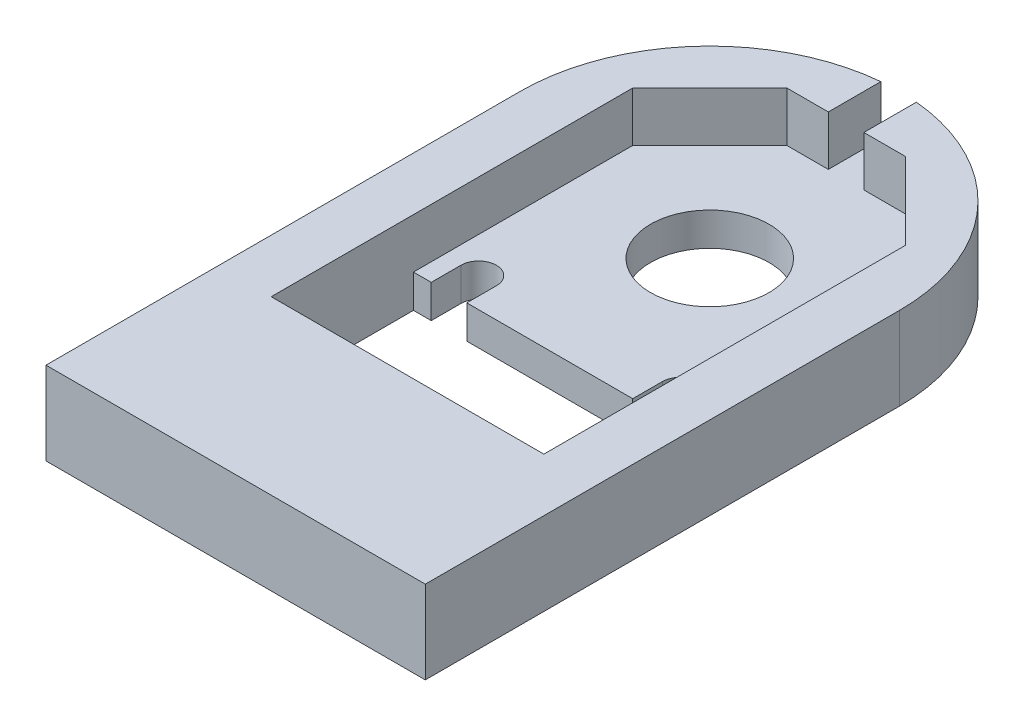
ISO-10303-21;
HEADER;
FILE_DESCRIPTION(('STEP AP214'),'2;1');
FILE_NAME('part.step','',(''),(''),'','','');
FILE_SCHEMA(('AUTOMOTIVE_DESIGN { 1 0 10303 214 1 1 1 1 }'));
ENDSEC;
DATA;
#1=APPLICATION_CONTEXT('core data for automotive mechanical design processes');
#2=APPLICATION_PROTOCOL_DEFINITION('international standard','automotive_design',2000,#1);
#3=PRODUCT_CONTEXT('',#1,'mechanical');
#4=PRODUCT('Part','Part','',(#3));
#5=PRODUCT_RELATED_PRODUCT_CATEGORY('part','',(#4));
#6=PRODUCT_DEFINITION_FORMATION('','',#4);
#7=PRODUCT_DEFINITION_CONTEXT('part definition',#1,'design');
#8=PRODUCT_DEFINITION('design','',#6,#7);
#9=PRODUCT_DEFINITION_SHAPE('','',#8);
#10=(LENGTH_UNIT() NAMED_UNIT(*) SI_UNIT(.MILLI.,.METRE.));
#11=(NAMED_UNIT(*) PLANE_ANGLE_UNIT() SI_UNIT($,.RADIAN.));
#12=(NAMED_UNIT(*) SI_UNIT($,.STERADIAN.) SOLID_ANGLE_UNIT());
#13=UNCERTAINTY_MEASURE_WITH_UNIT(LENGTH_MEASURE(1.E-05),#10,'distance_accuracy_value','');
#14=(GEOMETRIC_REPRESENTATION_CONTEXT(3) GLOBAL_UNCERTAINTY_ASSIGNED_CONTEXT((#13)) GLOBAL_UNIT_ASSIGNED_CONTEXT((#10,
#11,#12)) REPRESENTATION_CONTEXT('',''));
#15=CARTESIAN_POINT('',(0.,0.,0.));
#16=DIRECTION('',(0.,0.,1.));
#17=DIRECTION('',(1.,0.,0.));
#18=AXIS2_PLACEMENT_3D('',#15,#16,#17);
#19=CARTESIAN_POINT('',(8.,2.1,0.));
#20=DIRECTION('',(-1.,0.,0.));
#21=DIRECTION('',(0.,0.,1.));
#22=AXIS2_PLACEMENT_3D('',#19,#20,#21);
#23=PLANE('',#22);
#24=DIRECTION('',(0.,-1.,0.));
#25=VECTOR('',#24,1.);
#26=CARTESIAN_POINT('',(8.,2.1,20.));
#27=LINE('',#26,#25);
#28=CARTESIAN_POINT('',(8.,2.1,20.));
#29=VERTEX_POINT('',#28);
#30=CARTESIAN_POINT('',(8.,-1.4,20.));
#31=VERTEX_POINT('',#30);
#32=EDGE_CURVE('E345',#29,#31,#27,.T.);
#33=ORIENTED_EDGE('',*,*,#32,.T.);
#34=DIRECTION('',(0.,0.,-1.));
#35=VECTOR('',#34,1.);
#36=CARTESIAN_POINT('',(8.,-1.4,0.));
#37=LINE('',#36,#35);
#38=CARTESIAN_POINT('',(8.,-1.4,0.));
#39=VERTEX_POINT('',#38);
#40=EDGE_CURVE('E309',#31,#39,#37,.T.);
#41=ORIENTED_EDGE('',*,*,#40,.T.);
#42=DIRECTION('',(0.,-1.,0.));
#43=VECTOR('',#42,1.);
#44=CARTESIAN_POINT('',(8.,2.1,0.));
#45=LINE('',#44,#43);
#46=CARTESIAN_POINT('',(8.,2.1,0.));
#47=VERTEX_POINT('',#46);
#48=EDGE_CURVE('E392',#47,#39,#45,.T.);
#49=ORIENTED_EDGE('',*,*,#48,.F.);
#50=DIRECTION('',(0.,0.,-1.));
#51=VECTOR('',#50,1.);
#52=CARTESIAN_POINT('',(8.,2.1,0.));
#53=LINE('',#52,#51);
#54=EDGE_CURVE('E315',#29,#47,#53,.T.);
#55=ORIENTED_EDGE('',*,*,#54,.F.);
#56=EDGE_LOOP('',(#33,#41,#49,#55));
#57=FACE_BOUND('',#56,.T.);
#58=ADVANCED_FACE('F36',(#57),#23,.F.);
#59=CARTESIAN_POINT('',(0.75,2.1,0.));
#60=DIRECTION('',(-1.,0.,0.));
#61=DIRECTION('',(0.,0.,1.));
#62=AXIS2_PLACEMENT_3D('',#59,#60,#61);
#63=PLANE('',#62);
#64=DIRECTION('',(0.,0.,-1.));
#65=VECTOR('',#64,1.);
#66=CARTESIAN_POINT('',(0.75,0.,0.));
#67=LINE('',#66,#65);
#68=CARTESIAN_POINT('',(0.75,0.,-5.75));
#69=VERTEX_POINT('',#68);
#70=CARTESIAN_POINT('',(0.75,0.,-7.964766161037));
#71=VERTEX_POINT('',#70);
#72=EDGE_CURVE('E312',#69,#71,#67,.T.);
#73=ORIENTED_EDGE('',*,*,#72,.F.);
#74=DIRECTION('',(0.,-1.,0.));
#75=VECTOR('',#74,1.);
#76=CARTESIAN_POINT('',(0.75,2.1,-5.75));
#77=LINE('',#76,#75);
#78=CARTESIAN_POINT('',(0.75,2.1,-5.75));
#79=VERTEX_POINT('',#78);
#80=EDGE_CURVE('E388',#79,#69,#77,.T.);
#81=ORIENTED_EDGE('',*,*,#80,.F.);
#82=DIRECTION('',(0.,0.,-1.));
#83=VECTOR('',#82,1.);
#84=CARTESIAN_POINT('',(0.75,2.1,0.));
#85=LINE('',#84,#83);
#86=CARTESIAN_POINT('',(0.75,2.1,-7.964766161037));
#87=VERTEX_POINT('',#86);
#88=EDGE_CURVE('E321',#79,#87,#85,.T.);
#89=ORIENTED_EDGE('',*,*,#88,.T.);
#90=DIRECTION('',(0.,-1.,0.));
#91=VECTOR('',#90,1.);
#92=CARTESIAN_POINT('',(0.75,2.1,-7.964766161037));
#93=LINE('',#92,#91);
#94=EDGE_CURVE('E390',#87,#71,#93,.T.);
#95=ORIENTED_EDGE('',*,*,#94,.T.);
#96=EDGE_LOOP('',(#73,#81,#89,#95));
#97=FACE_BOUND('',#96,.T.);
#98=ADVANCED_FACE('F435',(#97),#63,.T.);
#99=CARTESIAN_POINT('',(0.,2.1,-5.75));
#100=DIRECTION('',(0.,0.,-1.));
#101=DIRECTION('',(-1.,0.,0.));
#102=AXIS2_PLACEMENT_3D('',#99,#100,#101);
#103=PLANE('',#102);
#104=DIRECTION('',(1.,0.,0.));
#105=VECTOR('',#104,1.);
#106=CARTESIAN_POINT('',(0.,0.,-5.75));
#107=LINE('',#106,#105);
#108=CARTESIAN_POINT('',(2.5,0.,-5.75));
#109=VERTEX_POINT('',#108);
#110=EDGE_CURVE('E348',#69,#109,#107,.T.);
#111=ORIENTED_EDGE('',*,*,#110,.T.);
#112=DIRECTION('',(0.,-1.,0.));
#113=VECTOR('',#112,1.);
#114=CARTESIAN_POINT('',(2.5,2.1,-5.75));
#115=LINE('',#114,#113);
#116=CARTESIAN_POINT('',(2.5,2.1,-5.75));
#117=VERTEX_POINT('',#116);
#118=EDGE_CURVE('E385',#117,#109,#115,.T.);
#119=ORIENTED_EDGE('',*,*,#118,.F.);
#120=DIRECTION('',(1.,0.,0.));
#121=VECTOR('',#120,1.);
#122=CARTESIAN_POINT('',(0.,2.1,-5.75));
#123=LINE('',#122,#121);
#124=EDGE_CURVE('E325',#79,#117,#123,.T.);
#125=ORIENTED_EDGE('',*,*,#124,.F.);
#126=ORIENTED_EDGE('',*,*,#80,.T.);
#127=EDGE_LOOP('',(#111,#119,#125,#126));
#128=FACE_BOUND('',#127,.T.);
#129=ADVANCED_FACE('F442',(#128),#103,.F.);
#130=CARTESIAN_POINT('',(4.12499999999926,2.1,-4.12500000000171));
#131=DIRECTION('',(0.707106781186337,0.,-0.707106781186758));
#132=DIRECTION('',(-0.707106781186758,0.,-0.707106781186337));
#133=AXIS2_PLACEMENT_3D('',#130,#131,#132);
#134=PLANE('',#133);
#135=DIRECTION('',(0.707106781186758,0.,0.707106781186337));
#136=VECTOR('',#135,1.);
#137=CARTESIAN_POINT('',(4.12499999999926,0.,-4.12500000000171));
#138=LINE('',#137,#136);
#139=CARTESIAN_POINT('',(5.75000000000307,0.,-2.49999999999886));
#140=VERTEX_POINT('',#139);
#141=EDGE_CURVE('E350',#109,#140,#138,.T.);
#142=ORIENTED_EDGE('',*,*,#141,.T.);
#143=DIRECTION('',(0.,-1.,0.));
#144=VECTOR('',#143,1.);
#145=CARTESIAN_POINT('',(5.75000000000307,2.1,-2.49999999999886));
#146=LINE('',#145,#144);
#147=CARTESIAN_POINT('',(5.75000000000307,2.1,-2.49999999999886));
#148=VERTEX_POINT('',#147);
#149=EDGE_CURVE('E383',#148,#140,#146,.T.);
#150=ORIENTED_EDGE('',*,*,#149,.F.);
#151=DIRECTION('',(0.707106781186758,0.,0.707106781186337));
#152=VECTOR('',#151,1.);
#153=CARTESIAN_POINT('',(4.12499999999926,2.1,-4.12500000000171));
#154=LINE('',#153,#152);
#155=EDGE_CURVE('E327',#117,#148,#154,.T.);
#156=ORIENTED_EDGE('',*,*,#155,.F.);
#157=ORIENTED_EDGE('',*,*,#118,.T.);
#158=EDGE_LOOP('',(#142,#150,#156,#157));
#159=FACE_BOUND('',#158,.T.);
#160=ADVANCED_FACE('F445',(#159),#134,.F.);
#161=CARTESIAN_POINT('',(5.75000000000307,2.1,0.));
#162=DIRECTION('',(-1.,0.,0.));
#163=DIRECTION('',(0.,0.,1.));
#164=AXIS2_PLACEMENT_3D('',#161,#162,#163);
#165=PLANE('',#164);
#166=DIRECTION('',(0.,0.,-1.));
#167=VECTOR('',#166,1.);
#168=CARTESIAN_POINT('',(5.75000000000307,0.,0.));
#169=LINE('',#168,#167);
#170=CARTESIAN_POINT('',(5.75000000000307,0.,6.75000000000546));
#171=VERTEX_POINT('',#170);
#172=EDGE_CURVE('E207',#171,#140,#169,.T.);
#173=ORIENTED_EDGE('',*,*,#172,.F.);
#174=DIRECTION('',(0.,1.,0.));
#175=VECTOR('',#174,1.);
#176=CARTESIAN_POINT('',(5.75000000000307,-1.4,6.75000000000546));
#177=LINE('',#176,#175);
#178=CARTESIAN_POINT('',(5.75000000000307,-1.4,6.75000000000546));
#179=VERTEX_POINT('',#178);
#180=EDGE_CURVE('E201',#179,#171,#177,.T.);
#181=ORIENTED_EDGE('',*,*,#180,.F.);
#182=DIRECTION('',(0.,0.,-1.));
#183=VECTOR('',#182,1.);
#184=CARTESIAN_POINT('',(5.75000000000307,-1.4,6.75000000000546));
#185=LINE('',#184,#183);
#186=CARTESIAN_POINT('',(5.75000000000307,-1.4,16.7500000000055));
#187=VERTEX_POINT('',#186);
#188=EDGE_CURVE('E205',#187,#179,#185,.T.);
#189=ORIENTED_EDGE('',*,*,#188,.F.);
#190=DIRECTION('',(0.,-0.529998940003178,0.847998304005089));
#191=VECTOR('',#190,1.);
#192=CARTESIAN_POINT('',(5.75000000000307,-1.4,16.7500000000055));
#193=LINE('',#192,#191);
#194=CARTESIAN_POINT('',(5.75000000000307,1.1,12.7500000000055));
#195=VERTEX_POINT('',#194);
#196=EDGE_CURVE('E45',#187,#195,#193,.F.);
#197=ORIENTED_EDGE('',*,*,#196,.T.);
#198=DIRECTION('',(0.,1.,0.));
#199=VECTOR('',#198,1.);
#200=CARTESIAN_POINT('',(5.75000000000307,-1.4,12.7500000000055));
#201=LINE('',#200,#199);
#202=CARTESIAN_POINT('',(5.75000000000307,2.1,12.7500000000055));
#203=VERTEX_POINT('',#202);
#204=EDGE_CURVE('E211',#195,#203,#201,.T.);
#205=ORIENTED_EDGE('',*,*,#204,.T.);
#206=DIRECTION('',(0.,0.,-1.));
#207=VECTOR('',#206,1.);
#208=CARTESIAN_POINT('',(5.75000000000307,2.1,0.));
#209=LINE('',#208,#207);
#210=EDGE_CURVE('E329',#203,#148,#209,.T.);
#211=ORIENTED_EDGE('',*,*,#210,.T.);
#212=ORIENTED_EDGE('',*,*,#149,.T.);
#213=EDGE_LOOP('',(#173,#181,#189,#197,#205,#211,#212));
#214=FACE_BOUND('',#213,.T.);
#215=ADVANCED_FACE('F203',(#214),#165,.T.);
#216=CARTESIAN_POINT('',(-5.75000000000083,2.1,-1.90812549694622E-12));
#217=DIRECTION('',(1.,0.,3.31847912512338E-13));
#218=DIRECTION('',(3.31847912512338E-13,0.,-1.));
#219=AXIS2_PLACEMENT_3D('',#216,#217,#218);
#220=PLANE('',#219);
#221=DIRECTION('',(-3.31847912512338E-13,0.,1.));
#222=VECTOR('',#221,1.);
#223=CARTESIAN_POINT('',(-5.75000000000083,0.,-1.90812549694622E-12));
#224=LINE('',#223,#222);
#225=CARTESIAN_POINT('',(-5.75,0.,-2.50000000000006));
#226=VERTEX_POINT('',#225);
#227=CARTESIAN_POINT('',(-5.75000000000307,0.,6.75000000000546));
#228=VERTEX_POINT('',#227);
#229=EDGE_CURVE('E358',#226,#228,#224,.T.);
#230=ORIENTED_EDGE('',*,*,#229,.F.);
#231=DIRECTION('',(0.,-1.,0.));
#232=VECTOR('',#231,1.);
#233=CARTESIAN_POINT('',(-5.75,2.1,-2.50000000000006));
#234=LINE('',#233,#232);
#235=CARTESIAN_POINT('',(-5.75,2.1,-2.50000000000006));
#236=VERTEX_POINT('',#235);
#237=EDGE_CURVE('E381',#236,#226,#234,.T.);
#238=ORIENTED_EDGE('',*,*,#237,.F.);
#239=DIRECTION('',(-3.31847912512338E-13,0.,1.));
#240=VECTOR('',#239,1.);
#241=CARTESIAN_POINT('',(-5.75000000000083,2.1,-1.90812549694622E-12));
#242=LINE('',#241,#240);
#243=CARTESIAN_POINT('',(-5.75000000000307,2.1,12.7500000000055));
#244=VERTEX_POINT('',#243);
#245=EDGE_CURVE('E332',#236,#244,#242,.T.);
#246=ORIENTED_EDGE('',*,*,#245,.T.);
#247=DIRECTION('',(0.,1.,0.));
#248=VECTOR('',#247,1.);
#249=CARTESIAN_POINT('',(-5.75000000000307,-1.4,12.7500000000055));
#250=LINE('',#249,#248);
#251=CARTESIAN_POINT('',(-5.75000000000307,1.1,12.7500000000055));
#252=VERTEX_POINT('',#251);
#253=EDGE_CURVE('E221',#252,#244,#250,.T.);
#254=ORIENTED_EDGE('',*,*,#253,.F.);
#255=DIRECTION('',(2.81406466998092E-13,0.529998940003178,-0.847998304005089));
#256=VECTOR('',#255,1.);
#257=CARTESIAN_POINT('',(-5.75000000000639,-1.39999999999914,16.7500000000041));
#258=LINE('',#257,#256);
#259=CARTESIAN_POINT('',(-5.75000000000307,-1.4,16.7500000000055));
#260=VERTEX_POINT('',#259);
#261=EDGE_CURVE('E11',#252,#260,#258,.F.);
#262=ORIENTED_EDGE('',*,*,#261,.T.);
#263=DIRECTION('',(0.,0.,1.));
#264=VECTOR('',#263,1.);
#265=CARTESIAN_POINT('',(-5.75000000000307,-1.4,12.7500000000055));
#266=LINE('',#265,#264);
#267=CARTESIAN_POINT('',(-5.75000000000307,-1.4,6.75000000000546));
#268=VERTEX_POINT('',#267);
#269=EDGE_CURVE('E230',#268,#260,#266,.T.);
#270=ORIENTED_EDGE('',*,*,#269,.F.);
#271=DIRECTION('',(0.,1.,0.));
#272=VECTOR('',#271,1.);
#273=CARTESIAN_POINT('',(-5.75000000000307,-1.4,6.75000000000546));
#274=LINE('',#273,#272);
#275=EDGE_CURVE('E210',#268,#228,#274,.T.);
#276=ORIENTED_EDGE('',*,*,#275,.T.);
#277=EDGE_LOOP('',(#230,#238,#246,#254,#262,#270,#276));
#278=FACE_BOUND('',#277,.T.);
#279=ADVANCED_FACE('F451',(#278),#220,.T.);
#280=CARTESIAN_POINT('',(-4.12499999999998,2.1,-4.12500000000005));
#281=DIRECTION('',(-0.707106781186541,0.,-0.707106781186554));
#282=DIRECTION('',(-0.707106781186554,0.,0.707106781186541));
#283=AXIS2_PLACEMENT_3D('',#280,#281,#282);
#284=PLANE('',#283);
#285=DIRECTION('',(0.707106781186554,0.,-0.707106781186541));
#286=VECTOR('',#285,1.);
#287=CARTESIAN_POINT('',(-4.12499999999998,0.,-4.12500000000005));
#288=LINE('',#287,#286);
#289=CARTESIAN_POINT('',(-2.5,0.,-5.75));
#290=VERTEX_POINT('',#289);
#291=EDGE_CURVE('E362',#226,#290,#288,.T.);
#292=ORIENTED_EDGE('',*,*,#291,.T.);
#293=DIRECTION('',(0.,-1.,0.));
#294=VECTOR('',#293,1.);
#295=CARTESIAN_POINT('',(-2.5,2.1,-5.75));
#296=LINE('',#295,#294);
#297=CARTESIAN_POINT('',(-2.5,2.1,-5.75));
#298=VERTEX_POINT('',#297);
#299=EDGE_CURVE('E378',#298,#290,#296,.T.);
#300=ORIENTED_EDGE('',*,*,#299,.F.);
#301=DIRECTION('',(0.707106781186554,0.,-0.707106781186541));
#302=VECTOR('',#301,1.);
#303=CARTESIAN_POINT('',(-4.12499999999998,2.1,-4.12500000000005));
#304=LINE('',#303,#302);
#305=EDGE_CURVE('E335',#236,#298,#304,.T.);
#306=ORIENTED_EDGE('',*,*,#305,.F.);
#307=ORIENTED_EDGE('',*,*,#237,.T.);
#308=EDGE_LOOP('',(#292,#300,#306,#307));
#309=FACE_BOUND('',#308,.T.);
#310=ADVANCED_FACE('F455',(#309),#284,.F.);
#311=CARTESIAN_POINT('',(0.,2.1,-5.75));
#312=DIRECTION('',(0.,0.,-1.));
#313=DIRECTION('',(-1.,0.,0.));
#314=AXIS2_PLACEMENT_3D('',#311,#312,#313);
#315=PLANE('',#314);
#316=DIRECTION('',(1.,0.,0.));
#317=VECTOR('',#316,1.);
#318=CARTESIAN_POINT('',(0.,0.,-5.75));
#319=LINE('',#318,#317);
#320=CARTESIAN_POINT('',(-0.75,0.,-5.75));
#321=VERTEX_POINT('',#320);
#322=EDGE_CURVE('E364',#290,#321,#319,.T.);
#323=ORIENTED_EDGE('',*,*,#322,.T.);
#324=DIRECTION('',(0.,-1.,0.));
#325=VECTOR('',#324,1.);
#326=CARTESIAN_POINT('',(-0.75,2.1,-5.75));
#327=LINE('',#326,#325);
#328=CARTESIAN_POINT('',(-0.75,2.1,-5.75));
#329=VERTEX_POINT('',#328);
#330=EDGE_CURVE('E375',#329,#321,#327,.T.);
#331=ORIENTED_EDGE('',*,*,#330,.F.);
#332=DIRECTION('',(1.,0.,0.));
#333=VECTOR('',#332,1.);
#334=CARTESIAN_POINT('',(0.,2.1,-5.75));
#335=LINE('',#334,#333);
#336=EDGE_CURVE('E337',#298,#329,#335,.T.);
#337=ORIENTED_EDGE('',*,*,#336,.F.);
#338=ORIENTED_EDGE('',*,*,#299,.T.);
#339=EDGE_LOOP('',(#323,#331,#337,#338));
#340=FACE_BOUND('',#339,.T.);
#341=ADVANCED_FACE('F457',(#340),#315,.F.);
#342=CARTESIAN_POINT('',(-0.75,2.1,0.));
#343=DIRECTION('',(-1.,0.,0.));
#344=DIRECTION('',(0.,0.,1.));
#345=AXIS2_PLACEMENT_3D('',#342,#343,#344);
#346=PLANE('',#345);
#347=DIRECTION('',(0.,0.,-1.));
#348=VECTOR('',#347,1.);
#349=CARTESIAN_POINT('',(-0.75,0.,0.));
#350=LINE('',#349,#348);
#351=CARTESIAN_POINT('',(-0.75,0.,-7.964766161037));
#352=VERTEX_POINT('',#351);
#353=EDGE_CURVE('E319',#321,#352,#350,.T.);
#354=ORIENTED_EDGE('',*,*,#353,.T.);
#355=DIRECTION('',(0.,-1.,0.));
#356=VECTOR('',#355,1.);
#357=CARTESIAN_POINT('',(-0.75,2.1,-7.964766161037));
#358=LINE('',#357,#356);
#359=CARTESIAN_POINT('',(-0.75,2.1,-7.964766161037));
#360=VERTEX_POINT('',#359);
#361=EDGE_CURVE('E372',#360,#352,#358,.T.);
#362=ORIENTED_EDGE('',*,*,#361,.F.);
#363=DIRECTION('',(0.,0.,-1.));
#364=VECTOR('',#363,1.);
#365=CARTESIAN_POINT('',(-0.75,2.1,0.));
#366=LINE('',#365,#364);
#367=EDGE_CURVE('E339',#329,#360,#366,.T.);
#368=ORIENTED_EDGE('',*,*,#367,.F.);
#369=ORIENTED_EDGE('',*,*,#330,.T.);
#370=EDGE_LOOP('',(#354,#362,#368,#369));
#371=FACE_BOUND('',#370,.T.);
#372=ADVANCED_FACE('F425',(#371),#346,.F.);
#373=CARTESIAN_POINT('',(0.,2.1,0.));
#374=DIRECTION('',(0.,-1.,0.));
#375=DIRECTION('',(0.,0.,-1.));
#376=AXIS2_PLACEMENT_3D('',#373,#374,#375);
#377=CYLINDRICAL_SURFACE('',#376,8.);
#378=ORIENTED_EDGE('',*,*,#361,.T.);
#379=CARTESIAN_POINT('',(0.,0.,0.));
#380=DIRECTION('',(0.,1.,0.));
#381=DIRECTION('',(0.,0.,1.));
#382=AXIS2_PLACEMENT_3D('',#379,#380,#381);
#383=CIRCLE('',#382,8.);
#384=EDGE_CURVE('E297',#71,#352,#383,.T.);
#385=ORIENTED_EDGE('',*,*,#384,.F.);
#386=ORIENTED_EDGE('',*,*,#94,.F.);
#387=CARTESIAN_POINT('',(0.,2.1,0.));
#388=DIRECTION('',(0.,1.,0.));
#389=DIRECTION('',(0.,0.,1.));
#390=AXIS2_PLACEMENT_3D('',#387,#388,#389);
#391=CIRCLE('',#390,8.);
#392=EDGE_CURVE('E318',#47,#87,#391,.T.);
#393=ORIENTED_EDGE('',*,*,#392,.F.);
#394=ORIENTED_EDGE('',*,*,#48,.T.);
#395=CARTESIAN_POINT('',(0.,-1.4,0.));
#396=DIRECTION('',(0.,1.,0.));
#397=DIRECTION('',(0.,0.,1.));
#398=AXIS2_PLACEMENT_3D('',#395,#396,#397);
#399=CIRCLE('',#398,8.);
#400=CARTESIAN_POINT('',(-8.,-1.4,0.));
#401=VERTEX_POINT('',#400);
#402=EDGE_CURVE('E300',#39,#401,#399,.T.);
#403=ORIENTED_EDGE('',*,*,#402,.T.);
#404=DIRECTION('',(0.,-1.,0.));
#405=VECTOR('',#404,1.);
#406=CARTESIAN_POINT('',(-8.,2.1,0.));
#407=LINE('',#406,#405);
#408=CARTESIAN_POINT('',(-8.,2.1,0.));
#409=VERTEX_POINT('',#408);
#410=EDGE_CURVE('E370',#409,#401,#407,.T.);
#411=ORIENTED_EDGE('',*,*,#410,.F.);
#412=EDGE_CURVE('E322',#360,#409,#391,.T.);
#413=ORIENTED_EDGE('',*,*,#412,.F.);
#414=EDGE_LOOP('',(#378,#385,#386,#393,#394,#403,#411,#413));
#415=FACE_BOUND('',#414,.T.);
#416=ADVANCED_FACE('F398',(#415),#377,.T.);
#417=CARTESIAN_POINT('',(-8.,2.1,0.));
#418=DIRECTION('',(1.,0.,0.));
#419=DIRECTION('',(0.,0.,-1.));
#420=AXIS2_PLACEMENT_3D('',#417,#418,#419);
#421=PLANE('',#420);
#422=ORIENTED_EDGE('',*,*,#410,.T.);
#423=DIRECTION('',(0.,0.,1.));
#424=VECTOR('',#423,1.);
#425=CARTESIAN_POINT('',(-8.,-1.4,20.));
#426=LINE('',#425,#424);
#427=CARTESIAN_POINT('',(-8.,-1.4,20.));
#428=VERTEX_POINT('',#427);
#429=EDGE_CURVE('E303',#401,#428,#426,.T.);
#430=ORIENTED_EDGE('',*,*,#429,.T.);
#431=DIRECTION('',(0.,-1.,0.));
#432=VECTOR('',#431,1.);
#433=CARTESIAN_POINT('',(-8.,2.1,20.));
#434=LINE('',#433,#432);
#435=CARTESIAN_POINT('',(-8.,2.1,20.));
#436=VERTEX_POINT('',#435);
#437=EDGE_CURVE('E368',#436,#428,#434,.T.);
#438=ORIENTED_EDGE('',*,*,#437,.F.);
#439=DIRECTION('',(0.,0.,1.));
#440=VECTOR('',#439,1.);
#441=CARTESIAN_POINT('',(-8.,2.1,0.));
#442=LINE('',#441,#440);
#443=EDGE_CURVE('E341',#409,#436,#442,.T.);
#444=ORIENTED_EDGE('',*,*,#443,.F.);
#445=EDGE_LOOP('',(#422,#430,#438,#444));
#446=FACE_BOUND('',#445,.T.);
#447=ADVANCED_FACE('F413',(#446),#421,.F.);
#448=CARTESIAN_POINT('',(0.,2.1,20.));
#449=DIRECTION('',(0.,0.,-1.));
#450=DIRECTION('',(-1.,0.,0.));
#451=AXIS2_PLACEMENT_3D('',#448,#449,#450);
#452=PLANE('',#451);
#453=ORIENTED_EDGE('',*,*,#437,.T.);
#454=DIRECTION('',(1.,0.,0.));
#455=VECTOR('',#454,1.);
#456=CARTESIAN_POINT('',(8.,-1.4,20.));
#457=LINE('',#456,#455);
#458=EDGE_CURVE('E306',#428,#31,#457,.T.);
#459=ORIENTED_EDGE('',*,*,#458,.T.);
#460=ORIENTED_EDGE('',*,*,#32,.F.);
#461=DIRECTION('',(1.,0.,0.));
#462=VECTOR('',#461,1.);
#463=CARTESIAN_POINT('',(0.,2.1,20.));
#464=LINE('',#463,#462);
#465=EDGE_CURVE('E343',#436,#29,#464,.T.);
#466=ORIENTED_EDGE('',*,*,#465,.F.);
#467=EDGE_LOOP('',(#453,#459,#460,#466));
#468=FACE_BOUND('',#467,.T.);
#469=ADVANCED_FACE('F410',(#468),#452,.F.);
#470=CARTESIAN_POINT('',(0.,2.1,0.));
#471=DIRECTION('',(0.,1.,0.));
#472=DIRECTION('',(0.,0.,1.));
#473=AXIS2_PLACEMENT_3D('',#470,#471,#472);
#474=PLANE('',#473);
#475=DIRECTION('',(1.,0.,0.));
#476=VECTOR('',#475,1.);
#477=CARTESIAN_POINT('',(5.75000000000307,2.1,12.7500000000055));
#478=LINE('',#477,#476);
#479=EDGE_CURVE('E233',#244,#203,#478,.T.);
#480=ORIENTED_EDGE('',*,*,#479,.F.);
#481=ORIENTED_EDGE('',*,*,#245,.F.);
#482=ORIENTED_EDGE('',*,*,#305,.T.);
#483=ORIENTED_EDGE('',*,*,#336,.T.);
#484=ORIENTED_EDGE('',*,*,#367,.T.);
#485=ORIENTED_EDGE('',*,*,#412,.T.);
#486=ORIENTED_EDGE('',*,*,#443,.T.);
#487=ORIENTED_EDGE('',*,*,#465,.T.);
#488=ORIENTED_EDGE('',*,*,#54,.T.);
#489=ORIENTED_EDGE('',*,*,#392,.T.);
#490=ORIENTED_EDGE('',*,*,#88,.F.);
#491=ORIENTED_EDGE('',*,*,#124,.T.);
#492=ORIENTED_EDGE('',*,*,#155,.T.);
#493=ORIENTED_EDGE('',*,*,#210,.F.);
#494=EDGE_LOOP('',(#480,#481,#482,#483,#484,#485,#486,#487,#488,#489,#490,#491,#492,#493));
#495=FACE_BOUND('',#494,.T.);
#496=ADVANCED_FACE('F420',(#495),#474,.T.);
#497=CARTESIAN_POINT('',(0.,0.,0.));
#498=DIRECTION('',(0.,1.,0.));
#499=DIRECTION('',(0.,0.,1.));
#500=AXIS2_PLACEMENT_3D('',#497,#498,#499);
#501=PLANE('',#500);
#502=CARTESIAN_POINT('',(0.,0.,0.));
#503=DIRECTION('',(0.,1.,0.));
#504=DIRECTION('',(0.,0.,1.));
#505=AXIS2_PLACEMENT_3D('',#502,#503,#504);
#506=CIRCLE('',#505,2.5);
#507=CARTESIAN_POINT('',(0.,0.,2.5));
#508=VERTEX_POINT('',#507);
#509=EDGE_CURVE('E286',#508,#508,#506,.T.);
#510=ORIENTED_EDGE('',*,*,#509,.F.);
#511=EDGE_LOOP('',(#510));
#512=FACE_BOUND('',#511,.T.);
#513=ORIENTED_EDGE('',*,*,#353,.F.);
#514=ORIENTED_EDGE('',*,*,#322,.F.);
#515=ORIENTED_EDGE('',*,*,#291,.F.);
#516=ORIENTED_EDGE('',*,*,#229,.T.);
#517=DIRECTION('',(1.,0.,0.));
#518=VECTOR('',#517,1.);
#519=CARTESIAN_POINT('',(0.,0.,6.75000000000546));
#520=LINE('',#519,#518);
#521=CARTESIAN_POINT('',(-5.,0.,6.75000000000546));
#522=VERTEX_POINT('',#521);
#523=EDGE_CURVE('E355',#228,#522,#520,.T.);
#524=ORIENTED_EDGE('',*,*,#523,.T.);
#525=DIRECTION('',(0.,0.,1.));
#526=VECTOR('',#525,1.);
#527=CARTESIAN_POINT('',(-5.,0.,5.50000000000546));
#528=LINE('',#527,#526);
#529=CARTESIAN_POINT('',(-5.,0.,5.50000000000546));
#530=VERTEX_POINT('',#529);
#531=EDGE_CURVE('E279',#530,#522,#528,.T.);
#532=ORIENTED_EDGE('',*,*,#531,.F.);
#533=CARTESIAN_POINT('',(-4.25,0.,5.50000000000546));
#534=DIRECTION('',(0.,1.,0.));
#535=DIRECTION('',(0.,0.,1.));
#536=AXIS2_PLACEMENT_3D('',#533,#534,#535);
#537=CIRCLE('',#536,0.75);
#538=CARTESIAN_POINT('',(-3.5,0.,5.50000000000546));
#539=VERTEX_POINT('',#538);
#540=EDGE_CURVE('E261',#539,#530,#537,.T.);
#541=ORIENTED_EDGE('',*,*,#540,.F.);
#542=DIRECTION('',(0.,0.,-1.));
#543=VECTOR('',#542,1.);
#544=CARTESIAN_POINT('',(-3.5,0.,6.75000000000546));
#545=LINE('',#544,#543);
#546=CARTESIAN_POINT('',(-3.5,0.,6.75000000000546));
#547=VERTEX_POINT('',#546);
#548=EDGE_CURVE('E271',#547,#539,#545,.T.);
#549=ORIENTED_EDGE('',*,*,#548,.F.);
#550=CARTESIAN_POINT('',(3.50000000000307,0.,6.75000000000546));
#551=VERTEX_POINT('',#550);
#552=EDGE_CURVE('E359',#547,#551,#520,.T.);
#553=ORIENTED_EDGE('',*,*,#552,.T.);
#554=DIRECTION('',(0.,0.,1.));
#555=VECTOR('',#554,1.);
#556=CARTESIAN_POINT('',(3.50000000000307,0.,5.50000000000546));
#557=LINE('',#556,#555);
#558=CARTESIAN_POINT('',(3.50000000000307,0.,5.50000000000546));
#559=VERTEX_POINT('',#558);
#560=EDGE_CURVE('E254',#559,#551,#557,.T.);
#561=ORIENTED_EDGE('',*,*,#560,.F.);
#562=CARTESIAN_POINT('',(4.25000000000307,0.,5.50000000000546));
#563=DIRECTION('',(0.,1.,0.));
#564=DIRECTION('',(0.,0.,1.));
#565=AXIS2_PLACEMENT_3D('',#562,#563,#564);
#566=CIRCLE('',#565,0.75);
#567=CARTESIAN_POINT('',(5.00000000000307,0.,5.50000000000546));
#568=VERTEX_POINT('',#567);
#569=EDGE_CURVE('E239',#568,#559,#566,.T.);
#570=ORIENTED_EDGE('',*,*,#569,.F.);
#571=DIRECTION('',(0.,0.,-1.));
#572=VECTOR('',#571,1.);
#573=CARTESIAN_POINT('',(5.00000000000307,0.,6.75000000000546));
#574=LINE('',#573,#572);
#575=CARTESIAN_POINT('',(5.00000000000307,0.,6.75000000000546));
#576=VERTEX_POINT('',#575);
#577=EDGE_CURVE('E247',#576,#568,#574,.T.);
#578=ORIENTED_EDGE('',*,*,#577,.F.);
#579=EDGE_CURVE('E354',#576,#171,#520,.T.);
#580=ORIENTED_EDGE('',*,*,#579,.T.);
#581=ORIENTED_EDGE('',*,*,#172,.T.);
#582=ORIENTED_EDGE('',*,*,#141,.F.);
#583=ORIENTED_EDGE('',*,*,#110,.F.);
#584=ORIENTED_EDGE('',*,*,#72,.T.);
#585=ORIENTED_EDGE('',*,*,#384,.T.);
#586=EDGE_LOOP('',(#513,#514,#515,#516,#524,#532,#541,#549,#553,#561,#570,#578,#580,#581,#582,
#583,#584,#585));
#587=FACE_BOUND('',#586,.T.);
#588=ADVANCED_FACE('F429',(#512,#587),#501,.T.);
#589=CARTESIAN_POINT('',(0.,-1.4,0.));
#590=DIRECTION('',(0.,1.,0.));
#591=DIRECTION('',(0.,0.,1.));
#592=AXIS2_PLACEMENT_3D('',#589,#590,#591);
#593=PLANE('',#592);
#594=DIRECTION('',(1.,0.,0.));
#595=VECTOR('',#594,1.);
#596=CARTESIAN_POINT('',(0.,-1.4,16.7500000000055));
#597=LINE('',#596,#595);
#598=EDGE_CURVE('E229',#260,#187,#597,.T.);
#599=ORIENTED_EDGE('',*,*,#598,.T.);
#600=ORIENTED_EDGE('',*,*,#188,.T.);
#601=DIRECTION('',(-1.,0.,0.));
#602=VECTOR('',#601,1.);
#603=CARTESIAN_POINT('',(-5.75000000000307,-1.4,6.75000000000546));
#604=LINE('',#603,#602);
#605=CARTESIAN_POINT('',(5.00000000000307,-1.4,6.75000000000546));
#606=VERTEX_POINT('',#605);
#607=EDGE_CURVE('E214',#179,#606,#604,.T.);
#608=ORIENTED_EDGE('',*,*,#607,.T.);
#609=DIRECTION('',(0.,0.,-1.));
#610=VECTOR('',#609,1.);
#611=CARTESIAN_POINT('',(5.00000000000307,-1.4,6.75000000000546));
#612=LINE('',#611,#610);
#613=CARTESIAN_POINT('',(5.00000000000307,-1.4,5.50000000000546));
#614=VERTEX_POINT('',#613);
#615=EDGE_CURVE('E250',#606,#614,#612,.T.);
#616=ORIENTED_EDGE('',*,*,#615,.T.);
#617=CARTESIAN_POINT('',(4.25000000000307,-1.4,5.50000000000546));
#618=DIRECTION('',(0.,1.,0.));
#619=DIRECTION('',(0.,0.,1.));
#620=AXIS2_PLACEMENT_3D('',#617,#618,#619);
#621=CIRCLE('',#620,0.75);
#622=CARTESIAN_POINT('',(3.50000000000307,-1.4,5.50000000000546));
#623=VERTEX_POINT('',#622);
#624=EDGE_CURVE('E243',#614,#623,#621,.T.);
#625=ORIENTED_EDGE('',*,*,#624,.T.);
#626=DIRECTION('',(0.,0.,1.));
#627=VECTOR('',#626,1.);
#628=CARTESIAN_POINT('',(3.50000000000307,-1.4,5.50000000000546));
#629=LINE('',#628,#627);
#630=CARTESIAN_POINT('',(3.50000000000307,-1.4,6.75000000000546));
#631=VERTEX_POINT('',#630);
#632=EDGE_CURVE('E246',#623,#631,#629,.T.);
#633=ORIENTED_EDGE('',*,*,#632,.T.);
#634=CARTESIAN_POINT('',(-3.5,-1.4,6.75000000000546));
#635=VERTEX_POINT('',#634);
#636=EDGE_CURVE('E222',#631,#635,#604,.T.);
#637=ORIENTED_EDGE('',*,*,#636,.T.);
#638=DIRECTION('',(0.,0.,-1.));
#639=VECTOR('',#638,1.);
#640=CARTESIAN_POINT('',(-3.5,-1.4,6.75000000000546));
#641=LINE('',#640,#639);
#642=CARTESIAN_POINT('',(-3.5,-1.4,5.50000000000546));
#643=VERTEX_POINT('',#642);
#644=EDGE_CURVE('E274',#635,#643,#641,.T.);
#645=ORIENTED_EDGE('',*,*,#644,.T.);
#646=CARTESIAN_POINT('',(-4.25,-1.4,5.50000000000546));
#647=DIRECTION('',(0.,1.,0.));
#648=DIRECTION('',(0.,0.,1.));
#649=AXIS2_PLACEMENT_3D('',#646,#647,#648);
#650=CIRCLE('',#649,0.75);
#651=CARTESIAN_POINT('',(-5.,-1.4,5.50000000000546));
#652=VERTEX_POINT('',#651);
#653=EDGE_CURVE('E267',#643,#652,#650,.T.);
#654=ORIENTED_EDGE('',*,*,#653,.T.);
#655=DIRECTION('',(0.,0.,1.));
#656=VECTOR('',#655,1.);
#657=CARTESIAN_POINT('',(-5.,-1.4,5.50000000000546));
#658=LINE('',#657,#656);
#659=CARTESIAN_POINT('',(-5.,-1.4,6.75000000000546));
#660=VERTEX_POINT('',#659);
#661=EDGE_CURVE('E270',#652,#660,#658,.T.);
#662=ORIENTED_EDGE('',*,*,#661,.T.);
#663=EDGE_CURVE('E224',#660,#268,#604,.T.);
#664=ORIENTED_EDGE('',*,*,#663,.T.);
#665=ORIENTED_EDGE('',*,*,#269,.T.);
#666=EDGE_LOOP('',(#599,#600,#608,#616,#625,#633,#637,#645,#654,#662,#664,#665));
#667=FACE_BOUND('',#666,.T.);
#668=CARTESIAN_POINT('',(0.,-1.4,0.));
#669=DIRECTION('',(0.,1.,0.));
#670=DIRECTION('',(0.,0.,1.));
#671=AXIS2_PLACEMENT_3D('',#668,#669,#670);
#672=CIRCLE('',#671,2.5);
#673=CARTESIAN_POINT('',(0.,-1.4,2.5));
#674=VERTEX_POINT('',#673);
#675=EDGE_CURVE('E294',#674,#674,#672,.T.);
#676=ORIENTED_EDGE('',*,*,#675,.T.);
#677=EDGE_LOOP('',(#676));
#678=FACE_BOUND('',#677,.T.);
#679=ORIENTED_EDGE('',*,*,#402,.F.);
#680=ORIENTED_EDGE('',*,*,#40,.F.);
#681=ORIENTED_EDGE('',*,*,#458,.F.);
#682=ORIENTED_EDGE('',*,*,#429,.F.);
#683=EDGE_LOOP('',(#679,#680,#681,#682));
#684=FACE_BOUND('',#683,.T.);
#685=ADVANCED_FACE('F226',(#667,#678,#684),#593,.F.);
#686=CARTESIAN_POINT('',(0.,-1.4,0.));
#687=DIRECTION('',(0.,1.,0.));
#688=DIRECTION('',(0.,0.,1.));
#689=AXIS2_PLACEMENT_3D('',#686,#687,#688);
#690=CYLINDRICAL_SURFACE('',#689,2.5);
#691=ORIENTED_EDGE('',*,*,#675,.F.);
#692=EDGE_LOOP('',(#691));
#693=FACE_BOUND('',#692,.T.);
#694=ORIENTED_EDGE('',*,*,#509,.T.);
#695=EDGE_LOOP('',(#694));
#696=FACE_BOUND('',#695,.T.);
#697=ADVANCED_FACE('F539',(#693,#696),#690,.F.);
#698=CARTESIAN_POINT('',(-4.25,-1.4,5.50000000000546));
#699=DIRECTION('',(0.,1.,0.));
#700=DIRECTION('',(0.,0.,1.));
#701=AXIS2_PLACEMENT_3D('',#698,#699,#700);
#702=CYLINDRICAL_SURFACE('',#701,0.75);
#703=ORIENTED_EDGE('',*,*,#540,.T.);
#704=DIRECTION('',(0.,1.,0.));
#705=VECTOR('',#704,1.);
#706=CARTESIAN_POINT('',(-5.,-1.4,5.50000000000546));
#707=LINE('',#706,#705);
#708=EDGE_CURVE('E277',#652,#530,#707,.T.);
#709=ORIENTED_EDGE('',*,*,#708,.F.);
#710=ORIENTED_EDGE('',*,*,#653,.F.);
#711=DIRECTION('',(0.,1.,0.));
#712=VECTOR('',#711,1.);
#713=CARTESIAN_POINT('',(-3.5,-1.4,5.50000000000546));
#714=LINE('',#713,#712);
#715=EDGE_CURVE('E284',#643,#539,#714,.T.);
#716=ORIENTED_EDGE('',*,*,#715,.T.);
#717=EDGE_LOOP('',(#703,#709,#710,#716));
#718=FACE_BOUND('',#717,.T.);
#719=ADVANCED_FACE('F544',(#718),#702,.F.);
#720=CARTESIAN_POINT('',(-3.5,-1.4,6.75000000000546));
#721=DIRECTION('',(1.,0.,0.));
#722=DIRECTION('',(0.,0.,-1.));
#723=AXIS2_PLACEMENT_3D('',#720,#721,#722);
#724=PLANE('',#723);
#725=ORIENTED_EDGE('',*,*,#548,.T.);
#726=ORIENTED_EDGE('',*,*,#715,.F.);
#727=ORIENTED_EDGE('',*,*,#644,.F.);
#728=DIRECTION('',(0.,1.,0.));
#729=VECTOR('',#728,1.);
#730=CARTESIAN_POINT('',(-3.5,-1.4,6.75000000000546));
#731=LINE('',#730,#729);
#732=EDGE_CURVE('E287',#635,#547,#731,.T.);
#733=ORIENTED_EDGE('',*,*,#732,.T.);
#734=EDGE_LOOP('',(#725,#726,#727,#733));
#735=FACE_BOUND('',#734,.T.);
#736=ADVANCED_FACE('F556',(#735),#724,.F.);
#737=CARTESIAN_POINT('',(-5.,-1.4,5.50000000000546));
#738=DIRECTION('',(-1.,0.,0.));
#739=DIRECTION('',(0.,0.,1.));
#740=AXIS2_PLACEMENT_3D('',#737,#738,#739);
#741=PLANE('',#740);
#742=ORIENTED_EDGE('',*,*,#531,.T.);
#743=DIRECTION('',(0.,1.,0.));
#744=VECTOR('',#743,1.);
#745=CARTESIAN_POINT('',(-5.,-1.4,6.75000000000546));
#746=LINE('',#745,#744);
#747=EDGE_CURVE('E290',#660,#522,#746,.T.);
#748=ORIENTED_EDGE('',*,*,#747,.F.);
#749=ORIENTED_EDGE('',*,*,#661,.F.);
#750=ORIENTED_EDGE('',*,*,#708,.T.);
#751=EDGE_LOOP('',(#742,#748,#749,#750));
#752=FACE_BOUND('',#751,.T.);
#753=ADVANCED_FACE('F570',(#752),#741,.F.);
#754=CARTESIAN_POINT('',(4.25000000000307,-1.4,5.50000000000546));
#755=DIRECTION('',(0.,1.,0.));
#756=DIRECTION('',(0.,0.,1.));
#757=AXIS2_PLACEMENT_3D('',#754,#755,#756);
#758=CYLINDRICAL_SURFACE('',#757,0.75);
#759=ORIENTED_EDGE('',*,*,#569,.T.);
#760=DIRECTION('',(0.,1.,0.));
#761=VECTOR('',#760,1.);
#762=CARTESIAN_POINT('',(3.50000000000307,-1.4,5.50000000000546));
#763=LINE('',#762,#761);
#764=EDGE_CURVE('E252',#623,#559,#763,.T.);
#765=ORIENTED_EDGE('',*,*,#764,.F.);
#766=ORIENTED_EDGE('',*,*,#624,.F.);
#767=DIRECTION('',(0.,1.,0.));
#768=VECTOR('',#767,1.);
#769=CARTESIAN_POINT('',(5.00000000000307,-1.4,5.50000000000546));
#770=LINE('',#769,#768);
#771=EDGE_CURVE('E259',#614,#568,#770,.T.);
#772=ORIENTED_EDGE('',*,*,#771,.T.);
#773=EDGE_LOOP('',(#759,#765,#766,#772));
#774=FACE_BOUND('',#773,.T.);
#775=ADVANCED_FACE('F564',(#774),#758,.F.);
#776=CARTESIAN_POINT('',(5.00000000000307,-1.4,6.75000000000546));
#777=DIRECTION('',(1.,0.,0.));
#778=DIRECTION('',(0.,0.,-1.));
#779=AXIS2_PLACEMENT_3D('',#776,#777,#778);
#780=PLANE('',#779);
#781=ORIENTED_EDGE('',*,*,#577,.T.);
#782=ORIENTED_EDGE('',*,*,#771,.F.);
#783=ORIENTED_EDGE('',*,*,#615,.F.);
#784=DIRECTION('',(0.,1.,0.));
#785=VECTOR('',#784,1.);
#786=CARTESIAN_POINT('',(5.00000000000307,-1.4,6.75000000000546));
#787=LINE('',#786,#785);
#788=EDGE_CURVE('E217',#606,#576,#787,.T.);
#789=ORIENTED_EDGE('',*,*,#788,.T.);
#790=EDGE_LOOP('',(#781,#782,#783,#789));
#791=FACE_BOUND('',#790,.T.);
#792=ADVANCED_FACE('F569',(#791),#780,.F.);
#793=CARTESIAN_POINT('',(3.50000000000307,-1.4,5.50000000000546));
#794=DIRECTION('',(-1.,0.,0.));
#795=DIRECTION('',(0.,0.,1.));
#796=AXIS2_PLACEMENT_3D('',#793,#794,#795);
#797=PLANE('',#796);
#798=ORIENTED_EDGE('',*,*,#560,.T.);
#799=DIRECTION('',(0.,1.,0.));
#800=VECTOR('',#799,1.);
#801=CARTESIAN_POINT('',(3.50000000000307,-1.4,6.75000000000546));
#802=LINE('',#801,#800);
#803=EDGE_CURVE('E263',#631,#551,#802,.T.);
#804=ORIENTED_EDGE('',*,*,#803,.F.);
#805=ORIENTED_EDGE('',*,*,#632,.F.);
#806=ORIENTED_EDGE('',*,*,#764,.T.);
#807=EDGE_LOOP('',(#798,#804,#805,#806));
#808=FACE_BOUND('',#807,.T.);
#809=ADVANCED_FACE('F611',(#808),#797,.F.);
#810=CARTESIAN_POINT('',(-5.75000000000307,-1.4,6.75000000000546));
#811=DIRECTION('',(0.,0.,-1.));
#812=DIRECTION('',(-1.,0.,0.));
#813=AXIS2_PLACEMENT_3D('',#810,#811,#812);
#814=PLANE('',#813);
#815=ORIENTED_EDGE('',*,*,#636,.F.);
#816=ORIENTED_EDGE('',*,*,#803,.T.);
#817=ORIENTED_EDGE('',*,*,#552,.F.);
#818=ORIENTED_EDGE('',*,*,#732,.F.);
#819=EDGE_LOOP('',(#815,#816,#817,#818));
#820=FACE_BOUND('',#819,.T.);
#821=ADVANCED_FACE('F621',(#820),#814,.F.);
#822=ORIENTED_EDGE('',*,*,#523,.F.);
#823=ORIENTED_EDGE('',*,*,#275,.F.);
#824=ORIENTED_EDGE('',*,*,#663,.F.);
#825=ORIENTED_EDGE('',*,*,#747,.T.);
#826=EDGE_LOOP('',(#822,#823,#824,#825));
#827=FACE_BOUND('',#826,.T.);
#828=ADVANCED_FACE('F632',(#827),#814,.F.);
#829=ORIENTED_EDGE('',*,*,#579,.F.);
#830=ORIENTED_EDGE('',*,*,#788,.F.);
#831=ORIENTED_EDGE('',*,*,#607,.F.);
#832=ORIENTED_EDGE('',*,*,#180,.T.);
#833=EDGE_LOOP('',(#829,#830,#831,#832));
#834=FACE_BOUND('',#833,.T.);
#835=ADVANCED_FACE('F215',(#834),#814,.F.);
#836=CARTESIAN_POINT('',(5.75000000000307,-1.4,12.7500000000055));
#837=DIRECTION('',(0.,0.,1.));
#838=DIRECTION('',(1.,0.,0.));
#839=AXIS2_PLACEMENT_3D('',#836,#837,#838);
#840=PLANE('',#839);
#841=ORIENTED_EDGE('',*,*,#204,.F.);
#842=DIRECTION('',(-1.,0.,0.));
#843=VECTOR('',#842,1.);
#844=CARTESIAN_POINT('',(5.75000000000307,1.1,12.7500000000055));
#845=LINE('',#844,#843);
#846=EDGE_CURVE('E52',#195,#252,#845,.T.);
#847=ORIENTED_EDGE('',*,*,#846,.T.);
#848=ORIENTED_EDGE('',*,*,#253,.T.);
#849=ORIENTED_EDGE('',*,*,#479,.T.);
#850=EDGE_LOOP('',(#841,#847,#848,#849));
#851=FACE_BOUND('',#850,.T.);
#852=ADVANCED_FACE('F447',(#851),#840,.F.);
#853=CARTESIAN_POINT('',(0.,-1.4,16.7500000000055));
#854=DIRECTION('',(0.,0.847998304005089,0.529998940003178));
#855=DIRECTION('',(1.,0.,0.));
#856=AXIS2_PLACEMENT_3D('',#853,#854,#855);
#857=PLANE('',#856);
#858=ORIENTED_EDGE('',*,*,#261,.F.);
#859=ORIENTED_EDGE('',*,*,#846,.F.);
#860=ORIENTED_EDGE('',*,*,#196,.F.);
#861=ORIENTED_EDGE('',*,*,#598,.F.);
#862=EDGE_LOOP('',(#858,#859,#860,#861));
#863=FACE_BOUND('',#862,.T.);
#864=ADVANCED_FACE('F39',(#863),#857,.F.);
#865=CLOSED_SHELL('',(#58,#98,#129,#160,#215,#279,#310,#341,#372,#416,#447,#469,#496,#588,#685,
#697,#719,#736,#753,#775,#792,#809,#821,#828,#835,#852,#864));
#866=MANIFOLD_SOLID_BREP('B2',#865);
#867=ADVANCED_BREP_SHAPE_REPRESENTATION('',(#18,#866),#14);
#868=SHAPE_DEFINITION_REPRESENTATION(#9,#867);
ENDSEC;
END-ISO-10303-21;
